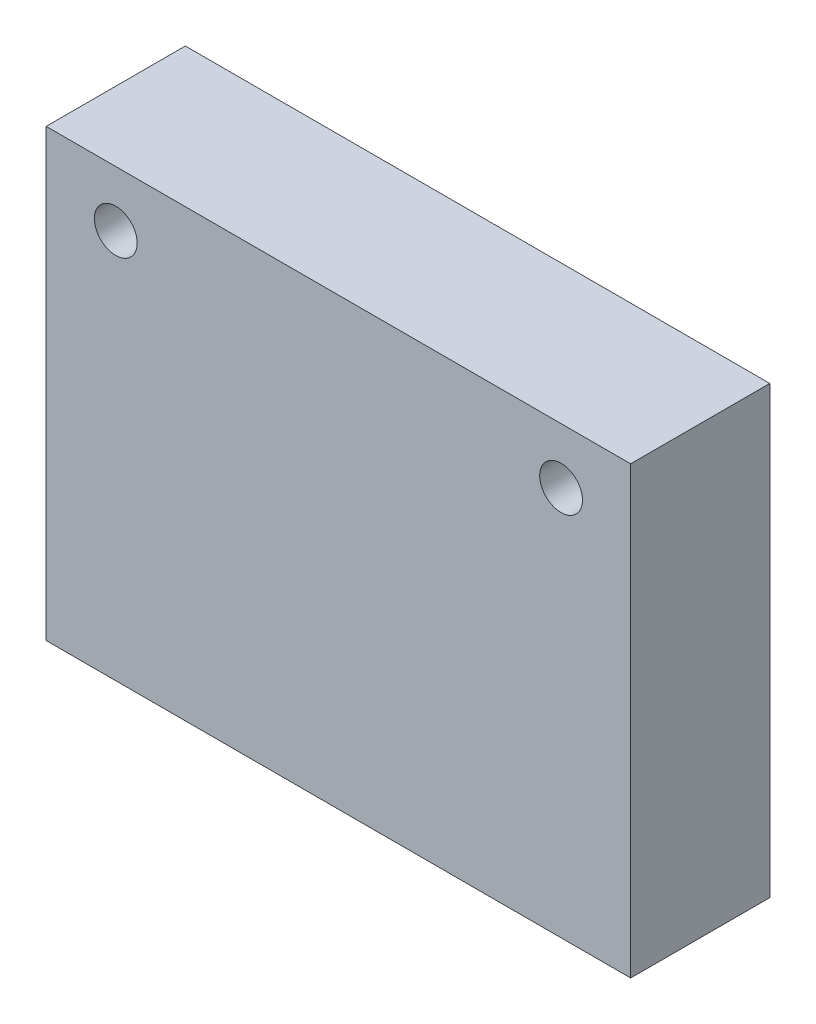
ISO-10303-21;
HEADER;
FILE_DESCRIPTION(('STEP AP214'),'2;1');
FILE_NAME('part.step','',(''),(''),'','','');
FILE_SCHEMA(('AUTOMOTIVE_DESIGN { 1 0 10303 214 1 1 1 1 }'));
ENDSEC;
DATA;
#1=APPLICATION_CONTEXT('core data for automotive mechanical design processes');
#2=APPLICATION_PROTOCOL_DEFINITION('international standard','automotive_design',2000,#1);
#3=PRODUCT_CONTEXT('',#1,'mechanical');
#4=PRODUCT('Part','Part','',(#3));
#5=PRODUCT_RELATED_PRODUCT_CATEGORY('part','',(#4));
#6=PRODUCT_DEFINITION_FORMATION('','',#4);
#7=PRODUCT_DEFINITION_CONTEXT('part definition',#1,'design');
#8=PRODUCT_DEFINITION('design','',#6,#7);
#9=PRODUCT_DEFINITION_SHAPE('','',#8);
#10=(LENGTH_UNIT() NAMED_UNIT(*) SI_UNIT(.MILLI.,.METRE.));
#11=(NAMED_UNIT(*) PLANE_ANGLE_UNIT() SI_UNIT($,.RADIAN.));
#12=(NAMED_UNIT(*) SI_UNIT($,.STERADIAN.) SOLID_ANGLE_UNIT());
#13=UNCERTAINTY_MEASURE_WITH_UNIT(LENGTH_MEASURE(1.E-05),#10,'distance_accuracy_value','');
#14=(GEOMETRIC_REPRESENTATION_CONTEXT(3) GLOBAL_UNCERTAINTY_ASSIGNED_CONTEXT((#13)) GLOBAL_UNIT_ASSIGNED_CONTEXT((#10,
#11,#12)) REPRESENTATION_CONTEXT('',''));
#15=CARTESIAN_POINT('',(0.,0.,0.));
#16=DIRECTION('',(0.,0.,1.));
#17=DIRECTION('',(1.,0.,0.));
#18=AXIS2_PLACEMENT_3D('',#15,#16,#17);
#19=CARTESIAN_POINT('',(-10.5,8.,5.));
#20=DIRECTION('',(0.,1.,0.));
#21=DIRECTION('',(-1.,0.,0.));
#22=AXIS2_PLACEMENT_3D('',#19,#20,#21);
#23=PLANE('',#22);
#24=DIRECTION('',(1.,0.,0.));
#25=VECTOR('',#24,1.);
#26=CARTESIAN_POINT('',(-10.5,8.,0.));
#27=LINE('',#26,#25);
#28=CARTESIAN_POINT('',(-10.5,8.,0.));
#29=VERTEX_POINT('',#28);
#30=CARTESIAN_POINT('',(10.5,8.,0.));
#31=VERTEX_POINT('',#30);
#32=EDGE_CURVE('E110',#29,#31,#27,.T.);
#33=ORIENTED_EDGE('',*,*,#32,.F.);
#34=DIRECTION('',(0.,0.,-1.));
#35=VECTOR('',#34,1.);
#36=CARTESIAN_POINT('',(-10.5,8.,5.));
#37=LINE('',#36,#35);
#38=CARTESIAN_POINT('',(-10.5,8.,5.));
#39=VERTEX_POINT('',#38);
#40=EDGE_CURVE('E11',#39,#29,#37,.T.);
#41=ORIENTED_EDGE('',*,*,#40,.F.);
#42=DIRECTION('',(1.,0.,0.));
#43=VECTOR('',#42,1.);
#44=CARTESIAN_POINT('',(-10.5,8.,5.));
#45=LINE('',#44,#43);
#46=CARTESIAN_POINT('',(10.5,8.,5.));
#47=VERTEX_POINT('',#46);
#48=EDGE_CURVE('E99',#39,#47,#45,.T.);
#49=ORIENTED_EDGE('',*,*,#48,.T.);
#50=DIRECTION('',(0.,0.,-1.));
#51=VECTOR('',#50,1.);
#52=CARTESIAN_POINT('',(10.5,8.,5.));
#53=LINE('',#52,#51);
#54=EDGE_CURVE('E44',#47,#31,#53,.T.);
#55=ORIENTED_EDGE('',*,*,#54,.T.);
#56=EDGE_LOOP('',(#33,#41,#49,#55));
#57=FACE_BOUND('',#56,.T.);
#58=ADVANCED_FACE('F45',(#57),#23,.T.);
#59=CARTESIAN_POINT('',(-10.5,-8.,5.));
#60=DIRECTION('',(-1.,0.,0.));
#61=DIRECTION('',(0.,-1.,0.));
#62=AXIS2_PLACEMENT_3D('',#59,#60,#61);
#63=PLANE('',#62);
#64=DIRECTION('',(0.,1.,0.));
#65=VECTOR('',#64,1.);
#66=CARTESIAN_POINT('',(-10.5,-8.,0.));
#67=LINE('',#66,#65);
#68=CARTESIAN_POINT('',(-10.5,-8.,0.));
#69=VERTEX_POINT('',#68);
#70=EDGE_CURVE('E105',#69,#29,#67,.T.);
#71=ORIENTED_EDGE('',*,*,#70,.F.);
#72=DIRECTION('',(0.,0.,-1.));
#73=VECTOR('',#72,1.);
#74=CARTESIAN_POINT('',(-10.5,-8.,5.));
#75=LINE('',#74,#73);
#76=CARTESIAN_POINT('',(-10.5,-8.,5.));
#77=VERTEX_POINT('',#76);
#78=EDGE_CURVE('E51',#77,#69,#75,.T.);
#79=ORIENTED_EDGE('',*,*,#78,.F.);
#80=DIRECTION('',(0.,1.,0.));
#81=VECTOR('',#80,1.);
#82=CARTESIAN_POINT('',(-10.5,-8.,5.));
#83=LINE('',#82,#81);
#84=EDGE_CURVE('E100',#77,#39,#83,.T.);
#85=ORIENTED_EDGE('',*,*,#84,.T.);
#86=ORIENTED_EDGE('',*,*,#40,.T.);
#87=EDGE_LOOP('',(#71,#79,#85,#86));
#88=FACE_BOUND('',#87,.T.);
#89=ADVANCED_FACE('F120',(#88),#63,.T.);
#90=CARTESIAN_POINT('',(10.5,-8.,5.));
#91=DIRECTION('',(0.,-1.,0.));
#92=DIRECTION('',(1.,0.,0.));
#93=AXIS2_PLACEMENT_3D('',#90,#91,#92);
#94=PLANE('',#93);
#95=DIRECTION('',(-1.,0.,0.));
#96=VECTOR('',#95,1.);
#97=CARTESIAN_POINT('',(10.5,-8.,0.));
#98=LINE('',#97,#96);
#99=CARTESIAN_POINT('',(10.5,-8.,0.));
#100=VERTEX_POINT('',#99);
#101=EDGE_CURVE('E95',#100,#69,#98,.T.);
#102=ORIENTED_EDGE('',*,*,#101,.F.);
#103=DIRECTION('',(0.,0.,-1.));
#104=VECTOR('',#103,1.);
#105=CARTESIAN_POINT('',(10.5,-8.,5.));
#106=LINE('',#105,#104);
#107=CARTESIAN_POINT('',(10.5,-8.,5.));
#108=VERTEX_POINT('',#107);
#109=EDGE_CURVE('E87',#108,#100,#106,.T.);
#110=ORIENTED_EDGE('',*,*,#109,.F.);
#111=DIRECTION('',(-1.,0.,0.));
#112=VECTOR('',#111,1.);
#113=CARTESIAN_POINT('',(10.5,-8.,5.));
#114=LINE('',#113,#112);
#115=EDGE_CURVE('E89',#108,#77,#114,.T.);
#116=ORIENTED_EDGE('',*,*,#115,.T.);
#117=ORIENTED_EDGE('',*,*,#78,.T.);
#118=EDGE_LOOP('',(#102,#110,#116,#117));
#119=FACE_BOUND('',#118,.T.);
#120=ADVANCED_FACE('F90',(#119),#94,.T.);
#121=CARTESIAN_POINT('',(10.5,8.,5.));
#122=DIRECTION('',(1.,0.,0.));
#123=DIRECTION('',(0.,0.,-1.));
#124=AXIS2_PLACEMENT_3D('',#121,#122,#123);
#125=PLANE('',#124);
#126=DIRECTION('',(0.,-1.,0.));
#127=VECTOR('',#126,1.);
#128=CARTESIAN_POINT('',(10.5,8.,0.));
#129=LINE('',#128,#127);
#130=EDGE_CURVE('E109',#31,#100,#129,.T.);
#131=ORIENTED_EDGE('',*,*,#130,.F.);
#132=ORIENTED_EDGE('',*,*,#54,.F.);
#133=DIRECTION('',(0.,-1.,0.));
#134=VECTOR('',#133,1.);
#135=CARTESIAN_POINT('',(10.5,8.,5.));
#136=LINE('',#135,#134);
#137=EDGE_CURVE('E96',#47,#108,#136,.T.);
#138=ORIENTED_EDGE('',*,*,#137,.T.);
#139=ORIENTED_EDGE('',*,*,#109,.T.);
#140=EDGE_LOOP('',(#131,#132,#138,#139));
#141=FACE_BOUND('',#140,.T.);
#142=ADVANCED_FACE('F97',(#141),#125,.T.);
#143=CARTESIAN_POINT('',(0.,0.,5.));
#144=DIRECTION('',(0.,0.,-1.));
#145=DIRECTION('',(-1.,0.,0.));
#146=AXIS2_PLACEMENT_3D('',#143,#144,#145);
#147=PLANE('',#146);
#148=CARTESIAN_POINT('',(-8.,6.,5.));
#149=DIRECTION('',(0.,0.,-1.));
#150=DIRECTION('',(1.,0.,0.));
#151=AXIS2_PLACEMENT_3D('',#148,#149,#150);
#152=CIRCLE('',#151,0.767903191278991);
#153=CARTESIAN_POINT('',(-7.23209680872101,6.,5.));
#154=VERTEX_POINT('',#153);
#155=EDGE_CURVE('E151',#154,#154,#152,.T.);
#156=ORIENTED_EDGE('',*,*,#155,.T.);
#157=EDGE_LOOP('',(#156));
#158=FACE_BOUND('',#157,.T.);
#159=CARTESIAN_POINT('',(8.,6.,5.));
#160=DIRECTION('',(0.,0.,-1.));
#161=DIRECTION('',(1.,0.,0.));
#162=AXIS2_PLACEMENT_3D('',#159,#160,#161);
#163=CIRCLE('',#162,0.767903191278995);
#164=CARTESIAN_POINT('',(8.76790319127899,6.,5.));
#165=VERTEX_POINT('',#164);
#166=EDGE_CURVE('E112',#165,#165,#163,.T.);
#167=ORIENTED_EDGE('',*,*,#166,.T.);
#168=EDGE_LOOP('',(#167));
#169=FACE_BOUND('',#168,.T.);
#170=ORIENTED_EDGE('',*,*,#48,.F.);
#171=ORIENTED_EDGE('',*,*,#84,.F.);
#172=ORIENTED_EDGE('',*,*,#115,.F.);
#173=ORIENTED_EDGE('',*,*,#137,.F.);
#174=EDGE_LOOP('',(#170,#171,#172,#173));
#175=FACE_BOUND('',#174,.T.);
#176=ADVANCED_FACE('F92',(#158,#169,#175),#147,.F.);
#177=CARTESIAN_POINT('',(0.,0.,0.));
#178=DIRECTION('',(0.,0.,-1.));
#179=DIRECTION('',(-1.,0.,0.));
#180=AXIS2_PLACEMENT_3D('',#177,#178,#179);
#181=PLANE('',#180);
#182=CARTESIAN_POINT('',(-8.,6.,0.));
#183=DIRECTION('',(0.,0.,-1.));
#184=DIRECTION('',(1.,0.,0.));
#185=AXIS2_PLACEMENT_3D('',#182,#183,#184);
#186=CIRCLE('',#185,0.767903191278991);
#187=CARTESIAN_POINT('',(-7.23209680872101,6.,0.));
#188=VERTEX_POINT('',#187);
#189=EDGE_CURVE('E152',#188,#188,#186,.T.);
#190=ORIENTED_EDGE('',*,*,#189,.F.);
#191=EDGE_LOOP('',(#190));
#192=FACE_BOUND('',#191,.T.);
#193=CARTESIAN_POINT('',(8.,6.,0.));
#194=DIRECTION('',(0.,0.,-1.));
#195=DIRECTION('',(1.,0.,0.));
#196=AXIS2_PLACEMENT_3D('',#193,#194,#195);
#197=CIRCLE('',#196,0.767903191278995);
#198=CARTESIAN_POINT('',(8.76790319127899,6.,0.));
#199=VERTEX_POINT('',#198);
#200=EDGE_CURVE('E156',#199,#199,#197,.T.);
#201=ORIENTED_EDGE('',*,*,#200,.F.);
#202=EDGE_LOOP('',(#201));
#203=FACE_BOUND('',#202,.T.);
#204=ORIENTED_EDGE('',*,*,#32,.T.);
#205=ORIENTED_EDGE('',*,*,#130,.T.);
#206=ORIENTED_EDGE('',*,*,#101,.T.);
#207=ORIENTED_EDGE('',*,*,#70,.T.);
#208=EDGE_LOOP('',(#204,#205,#206,#207));
#209=FACE_BOUND('',#208,.T.);
#210=ADVANCED_FACE('F116',(#192,#203,#209),#181,.T.);
#211=CARTESIAN_POINT('',(8.,6.,5.));
#212=DIRECTION('',(0.,0.,-1.));
#213=DIRECTION('',(-1.,0.,0.));
#214=AXIS2_PLACEMENT_3D('',#211,#212,#213);
#215=CYLINDRICAL_SURFACE('',#214,0.767903191278995);
#216=ORIENTED_EDGE('',*,*,#166,.F.);
#217=EDGE_LOOP('',(#216));
#218=FACE_BOUND('',#217,.T.);
#219=ORIENTED_EDGE('',*,*,#200,.T.);
#220=EDGE_LOOP('',(#219));
#221=FACE_BOUND('',#220,.T.);
#222=ADVANCED_FACE('F139',(#218,#221),#215,.F.);
#223=CARTESIAN_POINT('',(-8.,6.,5.));
#224=DIRECTION('',(0.,0.,-1.));
#225=DIRECTION('',(-1.,0.,0.));
#226=AXIS2_PLACEMENT_3D('',#223,#224,#225);
#227=CYLINDRICAL_SURFACE('',#226,0.767903191278991);
#228=ORIENTED_EDGE('',*,*,#155,.F.);
#229=EDGE_LOOP('',(#228));
#230=FACE_BOUND('',#229,.T.);
#231=ORIENTED_EDGE('',*,*,#189,.T.);
#232=EDGE_LOOP('',(#231));
#233=FACE_BOUND('',#232,.T.);
#234=ADVANCED_FACE('F141',(#230,#233),#227,.F.);
#235=CLOSED_SHELL('',(#58,#89,#120,#142,#176,#210,#222,#234));
#236=MANIFOLD_SOLID_BREP('B2',#235);
#237=ADVANCED_BREP_SHAPE_REPRESENTATION('',(#18,#236),#14);
#238=SHAPE_DEFINITION_REPRESENTATION(#9,#237);
ENDSEC;
END-ISO-10303-21;
